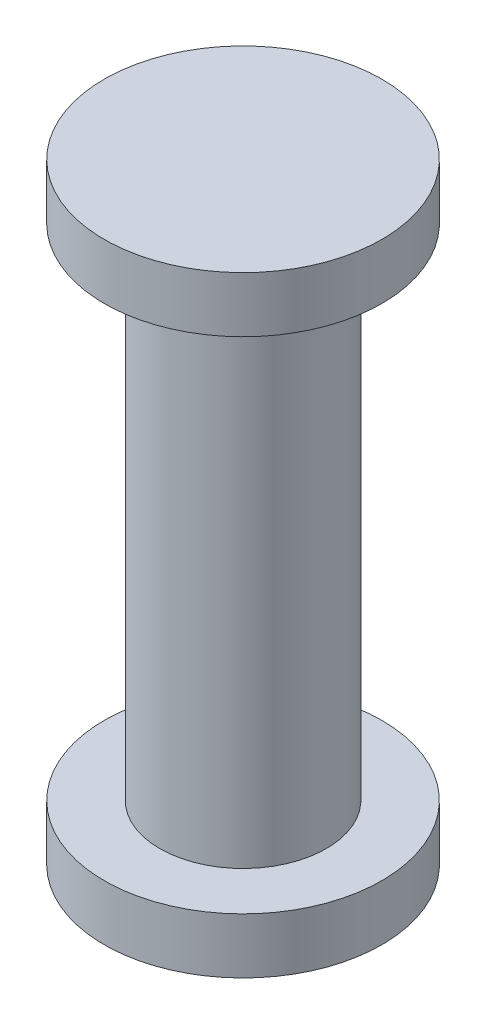
ISO-10303-21;
HEADER;
FILE_DESCRIPTION(('STEP AP214'),'2;1');
FILE_NAME('part.step','',(''),(''),'','','');
FILE_SCHEMA(('AUTOMOTIVE_DESIGN { 1 0 10303 214 1 1 1 1 }'));
ENDSEC;
DATA;
#1=APPLICATION_CONTEXT('core data for automotive mechanical design processes');
#2=APPLICATION_PROTOCOL_DEFINITION('international standard','automotive_design',2000,#1);
#3=PRODUCT_CONTEXT('',#1,'mechanical');
#4=PRODUCT('Part','Part','',(#3));
#5=PRODUCT_RELATED_PRODUCT_CATEGORY('part','',(#4));
#6=PRODUCT_DEFINITION_FORMATION('','',#4);
#7=PRODUCT_DEFINITION_CONTEXT('part definition',#1,'design');
#8=PRODUCT_DEFINITION('design','',#6,#7);
#9=PRODUCT_DEFINITION_SHAPE('','',#8);
#10=(LENGTH_UNIT() NAMED_UNIT(*) SI_UNIT(.MILLI.,.METRE.));
#11=(NAMED_UNIT(*) PLANE_ANGLE_UNIT() SI_UNIT($,.RADIAN.));
#12=(NAMED_UNIT(*) SI_UNIT($,.STERADIAN.) SOLID_ANGLE_UNIT());
#13=UNCERTAINTY_MEASURE_WITH_UNIT(LENGTH_MEASURE(1.E-05),#10,'distance_accuracy_value','');
#14=(GEOMETRIC_REPRESENTATION_CONTEXT(3) GLOBAL_UNCERTAINTY_ASSIGNED_CONTEXT((#13)) GLOBAL_UNIT_ASSIGNED_CONTEXT((#10,
#11,#12)) REPRESENTATION_CONTEXT('',''));
#15=CARTESIAN_POINT('',(0.,0.,0.));
#16=DIRECTION('',(0.,0.,1.));
#17=DIRECTION('',(1.,0.,0.));
#18=AXIS2_PLACEMENT_3D('',#15,#16,#17);
#19=CARTESIAN_POINT('',(-5.5,-6.6,0.));
#20=DIRECTION('',(0.,1.,0.));
#21=DIRECTION('',(0.,0.,1.));
#22=AXIS2_PLACEMENT_3D('',#19,#20,#21);
#23=PLANE('',#22);
#24=CARTESIAN_POINT('',(0.,-6.6,0.));
#25=DIRECTION('',(0.,-1.,0.));
#26=DIRECTION('',(0.,0.,-1.));
#27=AXIS2_PLACEMENT_3D('',#24,#25,#26);
#28=CIRCLE('',#27,5.5);
#29=CARTESIAN_POINT('',(0.,-6.6,-5.5));
#30=VERTEX_POINT('',#29);
#31=EDGE_CURVE('E55',#30,#30,#28,.T.);
#32=ORIENTED_EDGE('',*,*,#31,.T.);
#33=EDGE_LOOP('',(#32));
#34=FACE_BOUND('',#33,.T.);
#35=ADVANCED_FACE('F33',(#34),#23,.F.);
#36=CARTESIAN_POINT('',(0.,17.6,0.));
#37=DIRECTION('',(0.,-1.,0.));
#38=DIRECTION('',(0.,0.,-1.));
#39=AXIS2_PLACEMENT_3D('',#36,#37,#38);
#40=PLANE('',#39);
#41=CARTESIAN_POINT('',(0.,17.6,0.));
#42=DIRECTION('',(0.,-1.,0.));
#43=DIRECTION('',(0.,0.,-1.));
#44=AXIS2_PLACEMENT_3D('',#41,#42,#43);
#45=CIRCLE('',#44,5.5);
#46=CARTESIAN_POINT('',(0.,17.6,-5.5));
#47=VERTEX_POINT('',#46);
#48=EDGE_CURVE('E10',#47,#47,#45,.T.);
#49=ORIENTED_EDGE('',*,*,#48,.F.);
#50=EDGE_LOOP('',(#49));
#51=FACE_BOUND('',#50,.T.);
#52=ADVANCED_FACE('F85',(#51),#40,.F.);
#53=CARTESIAN_POINT('',(0.,-6.6,0.));
#54=DIRECTION('',(0.,-1.,0.));
#55=DIRECTION('',(0.,0.,-1.));
#56=AXIS2_PLACEMENT_3D('',#53,#54,#55);
#57=CYLINDRICAL_SURFACE('',#56,5.5);
#58=CARTESIAN_POINT('',(0.,15.4,0.));
#59=DIRECTION('',(0.,-1.,0.));
#60=DIRECTION('',(0.,0.,-1.));
#61=AXIS2_PLACEMENT_3D('',#58,#59,#60);
#62=CIRCLE('',#61,5.5);
#63=CARTESIAN_POINT('',(0.,15.4,-5.5));
#64=VERTEX_POINT('',#63);
#65=EDGE_CURVE('E39',#64,#64,#62,.T.);
#66=ORIENTED_EDGE('',*,*,#65,.F.);
#67=EDGE_LOOP('',(#66));
#68=FACE_BOUND('',#67,.T.);
#69=ORIENTED_EDGE('',*,*,#48,.T.);
#70=EDGE_LOOP('',(#69));
#71=FACE_BOUND('',#70,.T.);
#72=ADVANCED_FACE('F80',(#68,#71),#57,.T.);
#73=CARTESIAN_POINT('',(-5.5,15.4,0.));
#74=DIRECTION('',(0.,1.,0.));
#75=DIRECTION('',(0.,0.,1.));
#76=AXIS2_PLACEMENT_3D('',#73,#74,#75);
#77=PLANE('',#76);
#78=CARTESIAN_POINT('',(0.,15.4,0.));
#79=DIRECTION('',(0.,-1.,0.));
#80=DIRECTION('',(0.,0.,-1.));
#81=AXIS2_PLACEMENT_3D('',#78,#79,#80);
#82=CIRCLE('',#81,3.3);
#83=CARTESIAN_POINT('',(0.,15.4,-3.3));
#84=VERTEX_POINT('',#83);
#85=EDGE_CURVE('E43',#84,#84,#82,.T.);
#86=ORIENTED_EDGE('',*,*,#85,.F.);
#87=EDGE_LOOP('',(#86));
#88=FACE_BOUND('',#87,.T.);
#89=ORIENTED_EDGE('',*,*,#65,.T.);
#90=EDGE_LOOP('',(#89));
#91=FACE_BOUND('',#90,.T.);
#92=ADVANCED_FACE('F75',(#88,#91),#77,.F.);
#93=CARTESIAN_POINT('',(0.,-6.6,0.));
#94=DIRECTION('',(0.,-1.,0.));
#95=DIRECTION('',(0.,0.,-1.));
#96=AXIS2_PLACEMENT_3D('',#93,#94,#95);
#97=CYLINDRICAL_SURFACE('',#96,3.3);
#98=CARTESIAN_POINT('',(0.,-4.4,0.));
#99=DIRECTION('',(0.,-1.,0.));
#100=DIRECTION('',(0.,0.,-1.));
#101=AXIS2_PLACEMENT_3D('',#98,#99,#100);
#102=CIRCLE('',#101,3.3);
#103=CARTESIAN_POINT('',(0.,-4.4,-3.3));
#104=VERTEX_POINT('',#103);
#105=EDGE_CURVE('E47',#104,#104,#102,.T.);
#106=ORIENTED_EDGE('',*,*,#105,.F.);
#107=EDGE_LOOP('',(#106));
#108=FACE_BOUND('',#107,.T.);
#109=ORIENTED_EDGE('',*,*,#85,.T.);
#110=EDGE_LOOP('',(#109));
#111=FACE_BOUND('',#110,.T.);
#112=ADVANCED_FACE('F69',(#108,#111),#97,.T.);
#113=CARTESIAN_POINT('',(-3.3,-4.4,0.));
#114=DIRECTION('',(0.,-1.,0.));
#115=DIRECTION('',(0.,0.,-1.));
#116=AXIS2_PLACEMENT_3D('',#113,#114,#115);
#117=PLANE('',#116);
#118=CARTESIAN_POINT('',(0.,-4.4,0.));
#119=DIRECTION('',(0.,-1.,0.));
#120=DIRECTION('',(0.,0.,-1.));
#121=AXIS2_PLACEMENT_3D('',#118,#119,#120);
#122=CIRCLE('',#121,5.5);
#123=CARTESIAN_POINT('',(0.,-4.4,-5.5));
#124=VERTEX_POINT('',#123);
#125=EDGE_CURVE('E52',#124,#124,#122,.T.);
#126=ORIENTED_EDGE('',*,*,#125,.F.);
#127=EDGE_LOOP('',(#126));
#128=FACE_BOUND('',#127,.T.);
#129=ORIENTED_EDGE('',*,*,#105,.T.);
#130=EDGE_LOOP('',(#129));
#131=FACE_BOUND('',#130,.T.);
#132=ADVANCED_FACE('F63',(#128,#131),#117,.F.);
#133=CARTESIAN_POINT('',(0.,-6.6,0.));
#134=DIRECTION('',(0.,-1.,0.));
#135=DIRECTION('',(0.,0.,-1.));
#136=AXIS2_PLACEMENT_3D('',#133,#134,#135);
#137=CYLINDRICAL_SURFACE('',#136,5.5);
#138=ORIENTED_EDGE('',*,*,#31,.F.);
#139=EDGE_LOOP('',(#138));
#140=FACE_BOUND('',#139,.T.);
#141=ORIENTED_EDGE('',*,*,#125,.T.);
#142=EDGE_LOOP('',(#141));
#143=FACE_BOUND('',#142,.T.);
#144=ADVANCED_FACE('F60',(#140,#143),#137,.T.);
#145=CLOSED_SHELL('',(#35,#52,#72,#92,#112,#132,#144));
#146=MANIFOLD_SOLID_BREP('B2',#145);
#147=ADVANCED_BREP_SHAPE_REPRESENTATION('',(#18,#146),#14);
#148=SHAPE_DEFINITION_REPRESENTATION(#9,#147);
ENDSEC;
END-ISO-10303-21;
